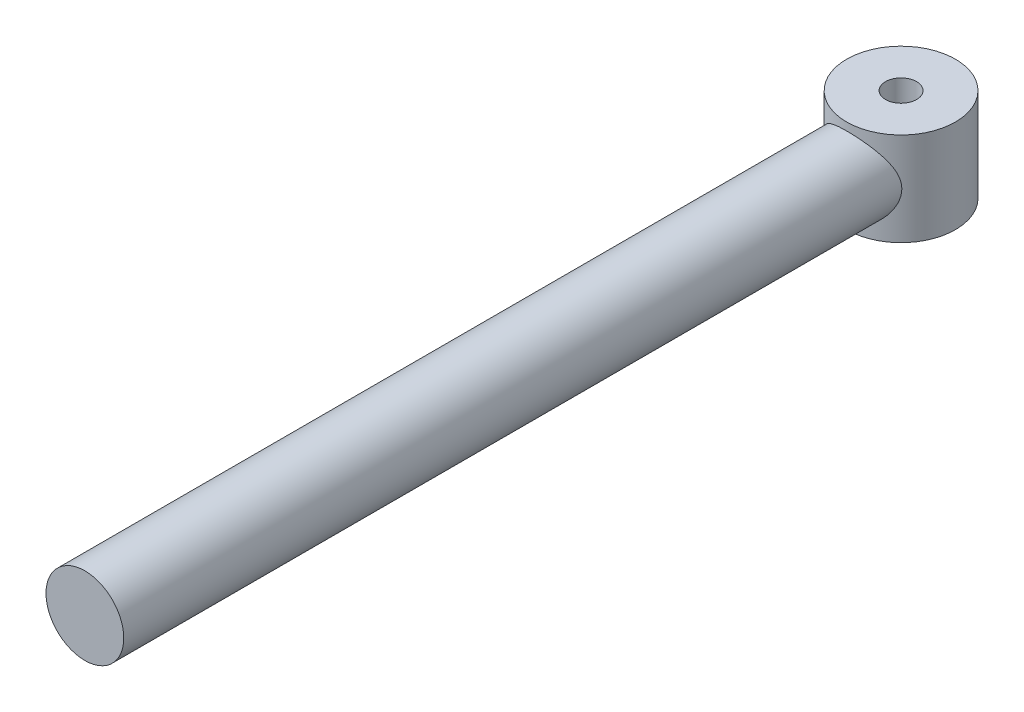
ISO-10303-21;
HEADER;
FILE_DESCRIPTION(('STEP AP214'),'2;1');
FILE_NAME('part.step','',(''),(''),'','','');
FILE_SCHEMA(('AUTOMOTIVE_DESIGN { 1 0 10303 214 1 1 1 1 }'));
ENDSEC;
DATA;
#1=APPLICATION_CONTEXT('core data for automotive mechanical design processes');
#2=APPLICATION_PROTOCOL_DEFINITION('international standard','automotive_design',2000,#1);
#3=PRODUCT_CONTEXT('',#1,'mechanical');
#4=PRODUCT('Part','Part','',(#3));
#5=PRODUCT_RELATED_PRODUCT_CATEGORY('part','',(#4));
#6=PRODUCT_DEFINITION_FORMATION('','',#4);
#7=PRODUCT_DEFINITION_CONTEXT('part definition',#1,'design');
#8=PRODUCT_DEFINITION('design','',#6,#7);
#9=PRODUCT_DEFINITION_SHAPE('','',#8);
#10=(LENGTH_UNIT() NAMED_UNIT(*) SI_UNIT(.MILLI.,.METRE.));
#11=(NAMED_UNIT(*) PLANE_ANGLE_UNIT() SI_UNIT($,.RADIAN.));
#12=(NAMED_UNIT(*) SI_UNIT($,.STERADIAN.) SOLID_ANGLE_UNIT());
#13=UNCERTAINTY_MEASURE_WITH_UNIT(LENGTH_MEASURE(1.E-05),#10,'distance_accuracy_value','');
#14=(GEOMETRIC_REPRESENTATION_CONTEXT(3) GLOBAL_UNCERTAINTY_ASSIGNED_CONTEXT((#13)) GLOBAL_UNIT_ASSIGNED_CONTEXT((#10,
#11,#12)) REPRESENTATION_CONTEXT('',''));
#15=CARTESIAN_POINT('',(0.,0.,0.));
#16=DIRECTION('',(0.,0.,1.));
#17=DIRECTION('',(1.,0.,0.));
#18=AXIS2_PLACEMENT_3D('',#15,#16,#17);
#19=CARTESIAN_POINT('',(0.,0.,525.));
#20=DIRECTION('',(0.,0.,-1.));
#21=DIRECTION('',(-1.,0.,0.));
#22=AXIS2_PLACEMENT_3D('',#19,#20,#21);
#23=CYLINDRICAL_SURFACE('',#22,25.);
#24=CARTESIAN_POINT('',(0.,0.,525.));
#25=DIRECTION('',(0.,0.,1.));
#26=DIRECTION('',(1.,0.,0.));
#27=AXIS2_PLACEMENT_3D('',#24,#25,#26);
#28=CIRCLE('',#27,25.);
#29=CARTESIAN_POINT('',(25.,0.,525.));
#30=VERTEX_POINT('',#29);
#31=EDGE_CURVE('E46',#30,#30,#28,.T.);
#32=ORIENTED_EDGE('',*,*,#31,.F.);
#33=EDGE_LOOP('',(#32));
#34=FACE_BOUND('',#33,.T.);
#35=CARTESIAN_POINT('',(-25.,0.,24.4948974278318));
#36=CARTESIAN_POINT('',(-25.0000011951093,0.59555990640448,24.494895250118));
#37=CARTESIAN_POINT('',(-24.9786715454106,1.19110726281446,24.5167224358193));
#38=CARTESIAN_POINT('',(-24.8939184235551,2.37607226600176,24.6027723680122));
#39=CARTESIAN_POINT('',(-24.8304937095523,2.96548973142018,24.6669963652513));
#40=CARTESIAN_POINT('',(-24.6629006635824,4.13408177611065,24.8345582869419));
#41=CARTESIAN_POINT('',(-24.5586441963227,4.71323134638966,24.9379808056741));
#42=CARTESIAN_POINT('',(-24.3115249626276,5.85590137083454,25.17894813454));
#43=CARTESIAN_POINT('',(-24.1686595245178,6.41942074044075,25.3164953059871));
#44=CARTESIAN_POINT('',(-23.848581957746,7.52133126167756,25.6182131886973));
#45=CARTESIAN_POINT('',(-23.6718037265572,8.05994316228461,25.7820436881321));
#46=CARTESIAN_POINT('',(-23.2849374038769,9.11749734575574,26.131966582875));
#47=CARTESIAN_POINT('',(-23.0748502376889,9.63644017451962,26.3180583597421));
#48=CARTESIAN_POINT('',(-22.623224519263,10.6536057473574,26.707274864337));
#49=CARTESIAN_POINT('',(-22.3816934391267,11.1518333770458,26.9103955413718));
#50=CARTESIAN_POINT('',(-21.8685991989693,12.1271614777257,27.3289960615426));
#51=CARTESIAN_POINT('',(-21.5970338312575,12.6042603920219,27.5444768126531));
#52=CARTESIAN_POINT('',(-20.9722900907902,13.6228788919818,28.0240129109334));
#53=CARTESIAN_POINT('',(-20.6132941782485,14.160068155083,28.2897020745226));
#54=CARTESIAN_POINT('',(-19.8562174567148,15.2034913709291,28.8261331033139));
#55=CARTESIAN_POINT('',(-19.4581336615128,15.709722953788,29.0968753532766));
#56=CARTESIAN_POINT('',(-18.6234177619393,16.6908239814155,29.6380839259275));
#57=CARTESIAN_POINT('',(-18.1867376185081,17.1656530190978,29.908549468558));
#58=CARTESIAN_POINT('',(-17.2761528938295,18.081806414408,30.4436120215668));
#59=CARTESIAN_POINT('',(-16.8022455981418,18.5231283242209,30.7082086021989));
#60=CARTESIAN_POINT('',(-15.730939440998,19.4453459213236,31.2724455893507));
#61=CARTESIAN_POINT('',(-15.1265282340359,19.9194236302348,31.5700010345339));
#62=CARTESIAN_POINT('',(-13.8691963875227,20.8144437742202,32.1422266283542));
#63=CARTESIAN_POINT('',(-13.2162663201219,21.2353758392854,32.4168923070973));
#64=CARTESIAN_POINT('',(-11.8657154833492,22.0184585853897,32.9351864068616));
#65=CARTESIAN_POINT('',(-11.1681731852311,22.3807087239448,33.1788671888269));
#66=CARTESIAN_POINT('',(-10.0913882167603,22.8761906560005,33.5157506625866));
#67=CARTESIAN_POINT('',(-9.72742525784963,23.0333536454565,33.6232614016562));
#68=CARTESIAN_POINT('',(-8.98980912171119,23.3311277726877,33.827944200352));
#69=CARTESIAN_POINT('',(-8.61615359966662,23.4717348588316,33.9251137286759));
#70=CARTESIAN_POINT('',(-7.69264323449467,23.7940507505523,34.1487629887229));
#71=CARTESIAN_POINT('',(-7.13800325829549,23.9664050831296,34.2691791208663));
#72=CARTESIAN_POINT('',(-6.01352879279665,24.272968925247,34.4842731904222));
#73=CARTESIAN_POINT('',(-5.44369766111491,24.4071867886672,34.5789567644119));
#74=CARTESIAN_POINT('',(-4.29256249642013,24.6357050348254,34.7406309327582));
#75=CARTESIAN_POINT('',(-3.71126600297117,24.730030790883,34.807639129363));
#76=CARTESIAN_POINT('',(-2.54083803591879,24.8775411622632,34.912596061624));
#77=CARTESIAN_POINT('',(-1.95170629267539,24.930724357972,34.9505437945557));
#78=CARTESIAN_POINT('',(-0.768717391471926,24.9952137554182,34.9965740623295));
#79=CARTESIAN_POINT('',(-0.174852831945055,25.0064303416137,35.0045926864331));
#80=CARTESIAN_POINT('',(1.01180047323045,24.9865643541006,34.9904036964921));
#81=CARTESIAN_POINT('',(1.60458922295482,24.9554819409792,34.9681961972002));
#82=CARTESIAN_POINT('',(2.78472635014011,24.851484528512,34.8940533297236));
#83=CARTESIAN_POINT('',(3.37207348213924,24.7785601816676,34.8421113188473));
#84=CARTESIAN_POINT('',(4.53695848032834,24.5919493702598,34.709647921428));
#85=CARTESIAN_POINT('',(5.11449635821745,24.4782629543153,34.629126568973));
#86=CARTESIAN_POINT('',(6.24104232516484,24.2151860128945,34.4436753539892));
#87=CARTESIAN_POINT('',(6.79040160592584,24.0668050967834,34.3394376032728));
#88=CARTESIAN_POINT('',(7.87317555408554,23.7346541369217,34.1074725159687));
#89=CARTESIAN_POINT('',(8.40659060930633,23.550884954754,33.9797457512614));
#90=CARTESIAN_POINT('',(9.45502480960256,23.1498933542044,33.7030636957981));
#91=CARTESIAN_POINT('',(9.97004258104187,22.9326684442502,33.5541068240188));
#92=CARTESIAN_POINT('',(10.9796640950827,22.4667785809202,33.2374329859887));
#93=CARTESIAN_POINT('',(11.4742666228487,22.2181117601203,33.0697149055249));
#94=CARTESIAN_POINT('',(12.4954303844769,21.6619223457075,32.6984910021977));
#95=CARTESIAN_POINT('',(13.019408646827,21.3509289371568,32.4930799046624));
#96=CARTESIAN_POINT('',(14.0386419725879,20.6950208878655,32.0659000802078));
#97=CARTESIAN_POINT('',(14.5338952272624,20.3501041147405,31.844130325221));
#98=CARTESIAN_POINT('',(15.4949446290582,19.6282497430201,31.3877348781296));
#99=CARTESIAN_POINT('',(15.9607149205928,19.2512846996888,31.1530982296691));
#100=CARTESIAN_POINT('',(16.861480854806,18.4674568552236,30.6749169777404));
#101=CARTESIAN_POINT('',(17.2964749879563,18.0605925895666,30.4313719382155));
#102=CARTESIAN_POINT('',(18.212377182724,17.1407348797499,29.8938253230071));
#103=CARTESIAN_POINT('',(18.6869483163743,16.6220106471425,29.5988051044933));
#104=CARTESIAN_POINT('',(19.5908147276405,15.5464965670886,29.0084713753866));
#105=CARTESIAN_POINT('',(20.0201009527585,14.9896991453006,28.7131578180196));
#106=CARTESIAN_POINT('',(20.831907995914,13.8393376902346,28.129725332414));
#107=CARTESIAN_POINT('',(21.2144255504804,13.2457710955895,27.8416069073596));
#108=CARTESIAN_POINT('',(21.9306077739893,12.0229071351632,27.2810390701408));
#109=CARTESIAN_POINT('',(22.2642856778331,11.393619513698,27.0085854252244));
#110=CARTESIAN_POINT('',(22.8106754911881,10.2460184744867,26.5475162941946));
#111=CARTESIAN_POINT('',(23.0337049386508,9.7346369239922,26.3538399612784));
#112=CARTESIAN_POINT('',(23.4471264274111,8.69176575087195,25.9867018349769));
#113=CARTESIAN_POINT('',(23.637521852831,8.16027822020643,25.8132379461752));
#114=CARTESIAN_POINT('',(23.9834173107537,7.0793462553981,25.4921823628218));
#115=CARTESIAN_POINT('',(24.1389710328284,6.52993096515212,25.3445509394428));
#116=CARTESIAN_POINT('',(24.4133554613538,5.4145904570218,25.0803594918896));
#117=CARTESIAN_POINT('',(24.5321865504874,4.84866541125129,24.9637991439285));
#118=CARTESIAN_POINT('',(24.7321379397725,3.69688182424606,24.7657327084717));
#119=CARTESIAN_POINT('',(24.812791660092,3.11086605694218,24.6846612001153));
#120=CARTESIAN_POINT('',(24.9324229607897,1.93032649381187,24.5638273280856));
#121=CARTESIAN_POINT('',(24.9714026474626,1.33580312951682,24.5240628766684));
#122=CARTESIAN_POINT('',(25.0066792052881,0.144512529638616,24.4880920880999));
#123=CARTESIAN_POINT('',(25.0030014709421,-0.452253159532492,24.4918598356757));
#124=CARTESIAN_POINT('',(24.9531158177881,-1.64210722972353,24.5426825343334));
#125=CARTESIAN_POINT('',(24.906910521221,-2.23519583520179,24.5897348164995));
#126=CARTESIAN_POINT('',(24.7837866571849,-3.31848278960121,24.7137632077941));
#127=CARTESIAN_POINT('',(24.7129034013135,-3.81007735925817,24.7848079283653));
#128=CARTESIAN_POINT('',(24.5429811338201,-4.78398097623614,24.9530834501032));
#129=CARTESIAN_POINT('',(24.4439321587292,-5.26628667309034,25.050323517088));
#130=CARTESIAN_POINT('',(24.2189393424154,-6.21957147920061,25.2679131094105));
#131=CARTESIAN_POINT('',(24.0929766016432,-6.69054236892502,25.388278868195));
#132=CARTESIAN_POINT('',(23.8155279575194,-7.61942586746501,25.6487193870493));
#133=CARTESIAN_POINT('',(23.6640358041633,-8.07733524644016,25.7887989719879));
#134=CARTESIAN_POINT('',(23.3793498202937,-8.86183130904996,26.0467406040615));
#135=CARTESIAN_POINT('',(23.2516216877342,-9.19163829458391,26.1609245687731));
#136=CARTESIAN_POINT('',(22.9833984685847,-9.84314332092162,26.3968808566711));
#137=CARTESIAN_POINT('',(22.8429058091456,-10.164842888537,26.5186517358419));
#138=CARTESIAN_POINT('',(22.4027430152552,-11.1178694220263,26.8935962344158));
#139=CARTESIAN_POINT('',(22.0844506287849,-11.7369528017061,27.1563441194715));
#140=CARTESIAN_POINT('',(21.4005688884831,-12.9420479777203,27.6984922985771));
#141=CARTESIAN_POINT('',(21.0349017833412,-13.5280030815862,27.9779195509893));
#142=CARTESIAN_POINT('',(20.2586333121862,-14.6649740465761,28.5450311803976));
#143=CARTESIAN_POINT('',(19.8480373305482,-15.2159940819219,28.8327145649189));
#144=CARTESIAN_POINT('',(18.9734725971168,-16.2941726973816,29.4158090877125));
#145=CARTESIAN_POINT('',(18.5085034609367,-16.8205051263815,29.7112473443866));
#146=CARTESIAN_POINT('',(17.5341648257475,-17.8338750119385,30.2964693493327));
#147=CARTESIAN_POINT('',(17.0247921092317,-18.3209096160227,30.5862526859812));
#148=CARTESIAN_POINT('',(15.9634833090007,-19.2526673463329,31.1533106863715));
#149=CARTESIAN_POINT('',(15.411600189976,-19.6974416297496,31.4306002545899));
#150=CARTESIAN_POINT('',(14.2661941558616,-20.5421970718292,31.9667855181693));
#151=CARTESIAN_POINT('',(13.6726783467741,-20.9421858445163,32.2256843374135));
#152=CARTESIAN_POINT('',(12.5368695003534,-21.6379848256756,32.6824749753339));
#153=CARTESIAN_POINT('',(11.9999991880608,-21.940451727491,32.8837244927386));
#154=CARTESIAN_POINT('',(10.899288191828,-22.5075250263594,33.264764813614));
#155=CARTESIAN_POINT('',(10.3354498161648,-22.7721346560189,33.4445574490554));
#156=CARTESIAN_POINT('',(9.18341578429594,-23.2606133150532,33.7790536245909));
#157=CARTESIAN_POINT('',(8.59522934511569,-23.4844975910864,33.9337665515941));
#158=CARTESIAN_POINT('',(7.39746823890808,-23.88884537715,34.2148476968731));
#159=CARTESIAN_POINT('',(6.78789344333,-24.0693086261552,34.3412157447536));
#160=CARTESIAN_POINT('',(5.54733115956772,-24.3852293486114,34.5633722712486));
#161=CARTESIAN_POINT('',(4.91623028253559,-24.5203867972605,34.6589567370517));
#162=CARTESIAN_POINT('',(3.64128574615895,-24.7418595930402,34.8159950039823));
#163=CARTESIAN_POINT('',(2.99744202430446,-24.8281747005135,34.8774486376382));
#164=CARTESIAN_POINT('',(1.70284065171969,-24.9504084738358,34.9645683925701));
#165=CARTESIAN_POINT('',(1.05208602279083,-24.986348320512,34.9902495547431));
#166=CARTESIAN_POINT('',(-0.250627355566639,-25.0072279070573,35.0051621807736));
#167=CARTESIAN_POINT('',(-0.902585990010753,-24.9921722884338,34.9943969619093));
#168=CARTESIAN_POINT('',(-2.13176295207632,-24.9157187649193,34.9398404907856));
#169=CARTESIAN_POINT('',(-2.7094766081941,-24.8594804716986,34.8997266723124));
#170=CARTESIAN_POINT('',(-3.85698118074628,-24.7074604477746,34.7916044393537));
#171=CARTESIAN_POINT('',(-4.4267727666648,-24.6116820798084,34.7235983970019));
#172=CARTESIAN_POINT('',(-5.55476786239282,-24.3818771573252,34.5610957767869));
#173=CARTESIAN_POINT('',(-6.11297018740276,-24.2478467126552,34.4665965046372));
#174=CARTESIAN_POINT('',(-7.21447108773228,-23.9432241310417,34.2529735541391));
#175=CARTESIAN_POINT('',(-7.75776897025929,-23.7726302977855,34.1338487333282));
#176=CARTESIAN_POINT('',(-8.83919036466102,-23.3924109694185,33.8701298828545));
#177=CARTESIAN_POINT('',(-9.37689526658699,-23.181965501688,33.7250050747206));
#178=CARTESIAN_POINT('',(-10.4313855731539,-22.7269879842568,33.4138957963434));
#179=CARTESIAN_POINT('',(-10.9481709092787,-22.4824558229265,33.2479112577872));
#180=CARTESIAN_POINT('',(-11.9589798709534,-21.9614688826655,32.8978553729954));
#181=CARTESIAN_POINT('',(-12.4530033610453,-21.6850139137935,32.7137839191434));
#182=CARTESIAN_POINT('',(-13.4169364200684,-21.1022063247259,32.3304027214783));
#183=CARTESIAN_POINT('',(-13.8868429580195,-20.7958499605419,32.1310910701007));
#184=CARTESIAN_POINT('',(-14.8719733229267,-20.1057135017863,31.6884705063193));
#185=CARTESIAN_POINT('',(-15.3830199749959,-19.7172777021605,31.4431149451188));
#186=CARTESIAN_POINT('',(-16.37038627757,-18.9055289200594,30.9405463082372));
#187=CARTESIAN_POINT('',(-16.8467029256359,-18.4822129288839,30.6833322105055));
#188=CARTESIAN_POINT('',(-17.7644862873001,-17.6019329320918,30.1612697026294));
#189=CARTESIAN_POINT('',(-18.2058908804998,-17.1449116258241,29.896408780247));
#190=CARTESIAN_POINT('',(-19.0520930691918,-16.199392715548,29.3643930369155));
#191=CARTESIAN_POINT('',(-19.4568885804997,-15.7108933221748,29.0972380863124));
#192=CARTESIAN_POINT('',(-20.2954708760124,-14.6166831768188,28.5200889956948));
#193=CARTESIAN_POINT('',(-20.722238560869,-14.0052777495625,28.2106434397686));
#194=CARTESIAN_POINT('',(-21.5222264424291,-12.7417814652564,27.6051713154676));
#195=CARTESIAN_POINT('',(-21.895432925401,-12.0896802496213,27.3091481969786));
#196=CARTESIAN_POINT('',(-22.5848127231805,-10.7468638854327,26.7418254061224));
#197=CARTESIAN_POINT('',(-22.9010618301,-10.0562016776879,26.4704931197351));
#198=CARTESIAN_POINT('',(-23.4729800829363,-8.63733296022238,25.9646881666285));
#199=CARTESIAN_POINT('',(-23.7286793266565,-7.90914532355441,25.7301972066087));
#200=CARTESIAN_POINT('',(-24.1215209852126,-6.59576324752931,25.3615195627263));
#201=CARTESIAN_POINT('',(-24.272398155952,-6.01764353994239,25.2167352619464));
#202=CARTESIAN_POINT('',(-24.5334664331865,-4.84456534221547,24.9628181606427));
#203=CARTESIAN_POINT('',(-24.6436651434071,-4.24961002144103,24.8536786977314));
#204=CARTESIAN_POINT('',(-24.8207923990897,-3.04884484033386,24.676791110376));
#205=CARTESIAN_POINT('',(-24.887839884602,-2.44306958797428,24.6089292389082));
#206=CARTESIAN_POINT('',(-24.9774416832852,-1.22485818832016,24.5179849135453));
#207=CARTESIAN_POINT('',(-24.9999987710526,-0.612422458794563,24.4948996672049));
#208=CARTESIAN_POINT('',(-25.,0.,24.4948974278318));
#209=B_SPLINE_CURVE_WITH_KNOTS('',3,(#35,#36,#37,#38,#39,#40,#41,#42,#43,#44,#45,#46,#47,#48,
#49,#50,#51,#52,#53,#54,#55,#56,#57,#58,#59,#60,#61,#62,#63,#64,#65,#66,#67,#68,#69,#70,#71,#72,
#73,#74,#75,#76,#77,#78,#79,#80,#81,#82,#83,#84,#85,#86,#87,#88,#89,#90,#91,#92,#93,#94,#95,#96,
#97,#98,#99,#100,#101,#102,#103,#104,#105,#106,#107,#108,#109,#110,#111,#112,#113,#114,#115,
#116,#117,#118,#119,#120,#121,#122,#123,#124,#125,#126,#127,#128,#129,#130,#131,#132,#133,#134,
#135,#136,#137,#138,#139,#140,#141,#142,#143,#144,#145,#146,#147,#148,#149,#150,#151,#152,#153,
#154,#155,#156,#157,#158,#159,#160,#161,#162,#163,#164,#165,#166,#167,#168,#169,#170,#171,#172,
#173,#174,#175,#176,#177,#178,#179,#180,#181,#182,#183,#184,#185,#186,#187,#188,#189,#190,#191,
#192,#193,#194,#195,#196,#197,#198,#199,#200,#201,#202,#203,#204,#205,#206,#207,#208),
.UNSPECIFIED.,.T.,.F.,(4,2,2,2,2,2,2,2,2,2,2,2,2,2,2,2,2,2,2,2,2,2,2,2,2,2,2,2,2,2,2,2,2,2,2,2,
2,2,2,2,2,2,2,2,2,2,2,2,2,2,2,2,2,2,2,2,2,2,2,2,2,2,2,2,2,2,2,2,2,2,2,2,2,2,2,2,2,2,2,2,2,2,2,2,
2,2,4),(0.,1.78589612183631,3.57184493171814,5.36167014650242,7.15161924584486,8.92003378085625,
10.6883991989022,12.456345159962,14.2244211615798,16.3183167070039,18.4123723451082,
20.5090720813942,22.6059248419727,25.0738551564098,27.5422662823543,30.0064490124967,
31.2382548619251,32.4703615403396,34.247826754161,36.0249023095027,37.8008458522543,
39.5768506707639,41.3566458143828,43.1364342010647,44.916620347817,46.6968043712557,
48.430513288241,50.1641800006897,51.8979758882226,53.6318747992174,55.5590446605933,
57.4863357392124,59.4152942188393,61.3443472457313,63.629322990858,65.9147546427609,
68.200345678902,70.48531619873,72.2555933128706,74.025686739465,75.7930334697989,
77.5603617821618,79.3487646226248,81.1370770691165,82.9243249652978,84.7114626675158,
86.2150838899894,87.7192376733281,89.2244512047476,90.7300337730415,91.8446035346655,
92.9589618047111,95.1882503683975,97.4212451162525,99.6539725496066,101.937408517221,
104.221010081548,106.501811096778,108.782223760345,110.725074434681,112.667759111189,
114.609714986537,116.551682535648,118.506267242421,120.460861539779,122.414633759898,
124.368228156275,126.111660266766,127.854944135341,129.598405355302,131.341947478483,
133.126290851097,134.910640067352,136.694999901063,138.479583443856,140.5392033713,
142.599001144082,144.662385188878,146.725886629932,149.144873601926,151.564478827054,
153.980840149075,156.395997825891,158.238016744586,160.07969117367,161.91626730582,
163.752728898222),.UNSPECIFIED.);
#210=CARTESIAN_POINT('',(-25.,0.,24.4948974278318));
#211=VERTEX_POINT('',#210);
#212=EDGE_CURVE('E10',#211,#211,#209,.T.);
#213=ORIENTED_EDGE('',*,*,#212,.F.);
#214=EDGE_LOOP('',(#213));
#215=FACE_BOUND('',#214,.T.);
#216=ADVANCED_FACE('F35',(#34,#215),#23,.T.);
#217=CARTESIAN_POINT('',(0.,0.,525.));
#218=DIRECTION('',(0.,0.,1.));
#219=DIRECTION('',(1.,0.,0.));
#220=AXIS2_PLACEMENT_3D('',#217,#218,#219);
#221=PLANE('',#220);
#222=ORIENTED_EDGE('',*,*,#31,.T.);
#223=EDGE_LOOP('',(#222));
#224=FACE_BOUND('',#223,.T.);
#225=ADVANCED_FACE('F83',(#224),#221,.T.);
#226=CARTESIAN_POINT('',(0.,30.,0.));
#227=DIRECTION('',(0.,-1.,0.));
#228=DIRECTION('',(0.,0.,-1.));
#229=AXIS2_PLACEMENT_3D('',#226,#227,#228);
#230=CYLINDRICAL_SURFACE('',#229,35.);
#231=CARTESIAN_POINT('',(0.,-30.,0.));
#232=DIRECTION('',(0.,1.,0.));
#233=DIRECTION('',(0.,0.,1.));
#234=AXIS2_PLACEMENT_3D('',#231,#232,#233);
#235=CIRCLE('',#234,35.);
#236=CARTESIAN_POINT('',(0.,-30.,35.));
#237=VERTEX_POINT('',#236);
#238=EDGE_CURVE('E54',#237,#237,#235,.T.);
#239=ORIENTED_EDGE('',*,*,#238,.T.);
#240=EDGE_LOOP('',(#239));
#241=FACE_BOUND('',#240,.T.);
#242=CARTESIAN_POINT('',(0.,30.,0.));
#243=DIRECTION('',(0.,1.,0.));
#244=DIRECTION('',(0.,0.,1.));
#245=AXIS2_PLACEMENT_3D('',#242,#243,#244);
#246=CIRCLE('',#245,35.);
#247=CARTESIAN_POINT('',(0.,30.,35.));
#248=VERTEX_POINT('',#247);
#249=EDGE_CURVE('E50',#248,#248,#246,.T.);
#250=ORIENTED_EDGE('',*,*,#249,.F.);
#251=EDGE_LOOP('',(#250));
#252=FACE_BOUND('',#251,.T.);
#253=ORIENTED_EDGE('',*,*,#212,.T.);
#254=EDGE_LOOP('',(#253));
#255=FACE_BOUND('',#254,.T.);
#256=ADVANCED_FACE('F79',(#241,#252,#255),#230,.T.);
#257=CARTESIAN_POINT('',(0.,30.,0.));
#258=DIRECTION('',(0.,-1.,0.));
#259=DIRECTION('',(0.,0.,-1.));
#260=AXIS2_PLACEMENT_3D('',#257,#258,#259);
#261=CYLINDRICAL_SURFACE('',#260,10.);
#262=CARTESIAN_POINT('',(0.,-30.,0.));
#263=DIRECTION('',(0.,1.,0.));
#264=DIRECTION('',(0.,0.,1.));
#265=AXIS2_PLACEMENT_3D('',#262,#263,#264);
#266=CIRCLE('',#265,10.);
#267=CARTESIAN_POINT('',(0.,-30.,10.));
#268=VERTEX_POINT('',#267);
#269=EDGE_CURVE('E60',#268,#268,#266,.T.);
#270=ORIENTED_EDGE('',*,*,#269,.F.);
#271=EDGE_LOOP('',(#270));
#272=FACE_BOUND('',#271,.T.);
#273=CARTESIAN_POINT('',(0.,30.,0.));
#274=DIRECTION('',(0.,1.,0.));
#275=DIRECTION('',(0.,0.,1.));
#276=AXIS2_PLACEMENT_3D('',#273,#274,#275);
#277=CIRCLE('',#276,10.);
#278=CARTESIAN_POINT('',(0.,30.,10.));
#279=VERTEX_POINT('',#278);
#280=EDGE_CURVE('E58',#279,#279,#277,.T.);
#281=ORIENTED_EDGE('',*,*,#280,.T.);
#282=EDGE_LOOP('',(#281));
#283=FACE_BOUND('',#282,.T.);
#284=ADVANCED_FACE('F66',(#272,#283),#261,.F.);
#285=CARTESIAN_POINT('',(0.,30.,0.));
#286=DIRECTION('',(0.,1.,0.));
#287=DIRECTION('',(0.,0.,1.));
#288=AXIS2_PLACEMENT_3D('',#285,#286,#287);
#289=PLANE('',#288);
#290=ORIENTED_EDGE('',*,*,#249,.T.);
#291=EDGE_LOOP('',(#290));
#292=FACE_BOUND('',#291,.T.);
#293=ORIENTED_EDGE('',*,*,#280,.F.);
#294=EDGE_LOOP('',(#293));
#295=FACE_BOUND('',#294,.T.);
#296=ADVANCED_FACE('F68',(#292,#295),#289,.T.);
#297=CARTESIAN_POINT('',(0.,-30.,0.));
#298=DIRECTION('',(0.,1.,0.));
#299=DIRECTION('',(0.,0.,1.));
#300=AXIS2_PLACEMENT_3D('',#297,#298,#299);
#301=PLANE('',#300);
#302=ORIENTED_EDGE('',*,*,#238,.F.);
#303=EDGE_LOOP('',(#302));
#304=FACE_BOUND('',#303,.T.);
#305=ORIENTED_EDGE('',*,*,#269,.T.);
#306=EDGE_LOOP('',(#305));
#307=FACE_BOUND('',#306,.T.);
#308=ADVANCED_FACE('F70',(#304,#307),#301,.F.);
#309=CLOSED_SHELL('',(#216,#225,#256,#284,#296,#308));
#310=MANIFOLD_SOLID_BREP('B2',#309);
#311=ADVANCED_BREP_SHAPE_REPRESENTATION('',(#18,#310),#14);
#312=SHAPE_DEFINITION_REPRESENTATION(#9,#311);
ENDSEC;
END-ISO-10303-21;
